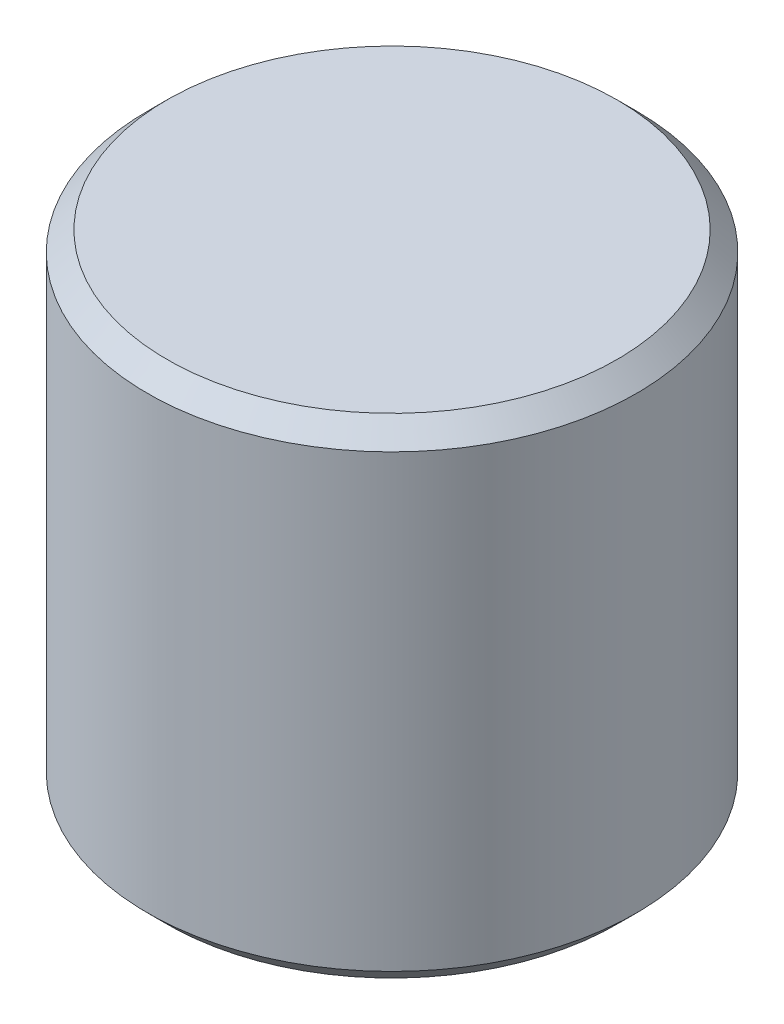
ISO-10303-21;
HEADER;
FILE_DESCRIPTION(('STEP AP214'),'2;1');
FILE_NAME('part.step','',(''),(''),'','','');
FILE_SCHEMA(('AUTOMOTIVE_DESIGN { 1 0 10303 214 1 1 1 1 }'));
ENDSEC;
DATA;
#1=APPLICATION_CONTEXT('core data for automotive mechanical design processes');
#2=APPLICATION_PROTOCOL_DEFINITION('international standard','automotive_design',2000,#1);
#3=PRODUCT_CONTEXT('',#1,'mechanical');
#4=PRODUCT('Part','Part','',(#3));
#5=PRODUCT_RELATED_PRODUCT_CATEGORY('part','',(#4));
#6=PRODUCT_DEFINITION_FORMATION('','',#4);
#7=PRODUCT_DEFINITION_CONTEXT('part definition',#1,'design');
#8=PRODUCT_DEFINITION('design','',#6,#7);
#9=PRODUCT_DEFINITION_SHAPE('','',#8);
#10=(LENGTH_UNIT() NAMED_UNIT(*) SI_UNIT(.MILLI.,.METRE.));
#11=(NAMED_UNIT(*) PLANE_ANGLE_UNIT() SI_UNIT($,.RADIAN.));
#12=(NAMED_UNIT(*) SI_UNIT($,.STERADIAN.) SOLID_ANGLE_UNIT());
#13=UNCERTAINTY_MEASURE_WITH_UNIT(LENGTH_MEASURE(1.E-05),#10,'distance_accuracy_value','');
#14=(GEOMETRIC_REPRESENTATION_CONTEXT(3) GLOBAL_UNCERTAINTY_ASSIGNED_CONTEXT((#13)) GLOBAL_UNIT_ASSIGNED_CONTEXT((#10,
#11,#12)) REPRESENTATION_CONTEXT('',''));
#15=CARTESIAN_POINT('',(0.,0.,0.));
#16=DIRECTION('',(0.,0.,1.));
#17=DIRECTION('',(1.,0.,0.));
#18=AXIS2_PLACEMENT_3D('',#15,#16,#17);
#19=CARTESIAN_POINT('',(0.,15.875,0.));
#20=DIRECTION('',(0.,-1.,0.));
#21=DIRECTION('',(0.,0.,1.));
#22=AXIS2_PLACEMENT_3D('',#19,#20,#21);
#23=CYLINDRICAL_SURFACE('',#22,7.9375);
#24=CARTESIAN_POINT('',(0.,0.634999999999995,0.));
#25=DIRECTION('',(0.,-1.,0.));
#26=DIRECTION('',(0.,0.,-1.));
#27=AXIS2_PLACEMENT_3D('',#24,#25,#26);
#28=CIRCLE('',#27,7.9375);
#29=CARTESIAN_POINT('',(0.,0.634999999999995,-7.9375));
#30=VERTEX_POINT('',#29);
#31=EDGE_CURVE('E52',#30,#30,#28,.T.);
#32=ORIENTED_EDGE('',*,*,#31,.F.);
#33=EDGE_LOOP('',(#32));
#34=FACE_BOUND('',#33,.T.);
#35=CARTESIAN_POINT('',(0.,15.24,0.));
#36=DIRECTION('',(0.,-1.,0.));
#37=DIRECTION('',(0.,0.,-1.));
#38=AXIS2_PLACEMENT_3D('',#35,#36,#37);
#39=CIRCLE('',#38,7.9375);
#40=CARTESIAN_POINT('',(0.,15.24,-7.9375));
#41=VERTEX_POINT('',#40);
#42=EDGE_CURVE('E56',#41,#41,#39,.F.);
#43=ORIENTED_EDGE('',*,*,#42,.F.);
#44=EDGE_LOOP('',(#43));
#45=FACE_BOUND('',#44,.T.);
#46=ADVANCED_FACE('F41',(#34,#45),#23,.T.);
#47=CARTESIAN_POINT('',(0.,15.875,0.));
#48=DIRECTION('',(0.,1.,0.));
#49=DIRECTION('',(0.,0.,-1.));
#50=AXIS2_PLACEMENT_3D('',#47,#48,#49);
#51=PLANE('',#50);
#52=CARTESIAN_POINT('',(0.,15.875,0.));
#53=DIRECTION('',(0.,-1.,0.));
#54=DIRECTION('',(0.,0.,-1.));
#55=AXIS2_PLACEMENT_3D('',#52,#53,#54);
#56=CIRCLE('',#55,7.3025);
#57=CARTESIAN_POINT('',(0.,15.875,-7.3025));
#58=VERTEX_POINT('',#57);
#59=EDGE_CURVE('E10',#58,#58,#56,.T.);
#60=ORIENTED_EDGE('',*,*,#59,.F.);
#61=EDGE_LOOP('',(#60));
#62=FACE_BOUND('',#61,.T.);
#63=ADVANCED_FACE('F64',(#62),#51,.T.);
#64=CARTESIAN_POINT('',(0.,0.,0.));
#65=DIRECTION('',(0.,1.,0.));
#66=DIRECTION('',(0.,0.,-1.));
#67=AXIS2_PLACEMENT_3D('',#64,#65,#66);
#68=PLANE('',#67);
#69=CARTESIAN_POINT('',(0.,0.,0.));
#70=DIRECTION('',(0.,-1.,0.));
#71=DIRECTION('',(0.,0.,-1.));
#72=AXIS2_PLACEMENT_3D('',#69,#70,#71);
#73=CIRCLE('',#72,7.3025);
#74=CARTESIAN_POINT('',(0.,0.,-7.3025));
#75=VERTEX_POINT('',#74);
#76=EDGE_CURVE('E48',#75,#75,#73,.F.);
#77=ORIENTED_EDGE('',*,*,#76,.F.);
#78=EDGE_LOOP('',(#77));
#79=FACE_BOUND('',#78,.T.);
#80=ADVANCED_FACE('F70',(#79),#68,.F.);
#81=CARTESIAN_POINT('',(0.,0.634999999999995,0.));
#82=DIRECTION('',(0.,1.,0.));
#83=DIRECTION('',(0.,0.,-1.));
#84=AXIS2_PLACEMENT_3D('',#81,#82,#83);
#85=CONICAL_SURFACE('',#84,7.9375,0.785398163397451);
#86=ORIENTED_EDGE('',*,*,#76,.T.);
#87=EDGE_LOOP('',(#86));
#88=FACE_BOUND('',#87,.T.);
#89=ORIENTED_EDGE('',*,*,#31,.T.);
#90=EDGE_LOOP('',(#89));
#91=FACE_BOUND('',#90,.T.);
#92=ADVANCED_FACE('F75',(#88,#91),#85,.T.);
#93=CARTESIAN_POINT('',(0.,15.875,0.));
#94=DIRECTION('',(0.,-1.,0.));
#95=DIRECTION('',(0.,0.,1.));
#96=AXIS2_PLACEMENT_3D('',#93,#94,#95);
#97=CONICAL_SURFACE('',#96,7.3025,0.785398163397444);
#98=ORIENTED_EDGE('',*,*,#42,.T.);
#99=EDGE_LOOP('',(#98));
#100=FACE_BOUND('',#99,.T.);
#101=ORIENTED_EDGE('',*,*,#59,.T.);
#102=EDGE_LOOP('',(#101));
#103=FACE_BOUND('',#102,.T.);
#104=ADVANCED_FACE('F43',(#100,#103),#97,.T.);
#105=CLOSED_SHELL('',(#46,#63,#80,#92,#104));
#106=MANIFOLD_SOLID_BREP('B2',#105);
#107=ADVANCED_BREP_SHAPE_REPRESENTATION('',(#18,#106),#14);
#108=SHAPE_DEFINITION_REPRESENTATION(#9,#107);
ENDSEC;
END-ISO-10303-21;
